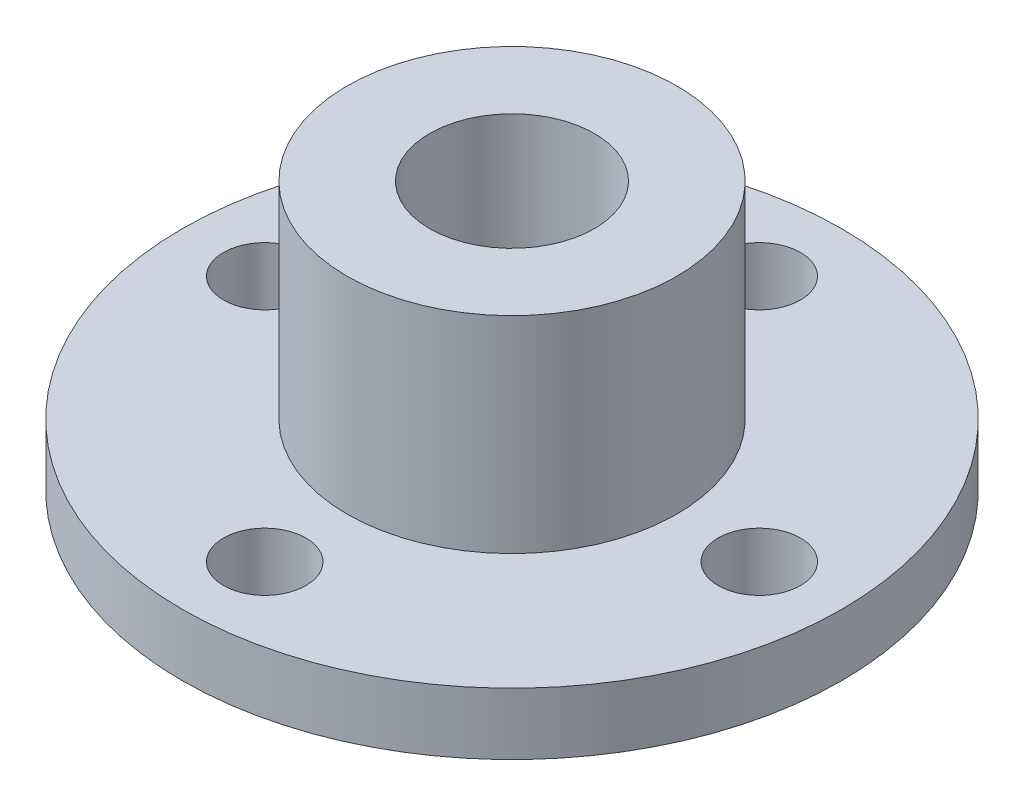
ISO-10303-21;
HEADER;
FILE_DESCRIPTION(('STEP AP214'),'2;1');
FILE_NAME('part.step','',(''),(''),'','','');
FILE_SCHEMA(('AUTOMOTIVE_DESIGN { 1 0 10303 214 1 1 1 1 }'));
ENDSEC;
DATA;
#1=APPLICATION_CONTEXT('core data for automotive mechanical design processes');
#2=APPLICATION_PROTOCOL_DEFINITION('international standard','automotive_design',2000,#1);
#3=PRODUCT_CONTEXT('',#1,'mechanical');
#4=PRODUCT('Part','Part','',(#3));
#5=PRODUCT_RELATED_PRODUCT_CATEGORY('part','',(#4));
#6=PRODUCT_DEFINITION_FORMATION('','',#4);
#7=PRODUCT_DEFINITION_CONTEXT('part definition',#1,'design');
#8=PRODUCT_DEFINITION('design','',#6,#7);
#9=PRODUCT_DEFINITION_SHAPE('','',#8);
#10=(LENGTH_UNIT() NAMED_UNIT(*) SI_UNIT(.MILLI.,.METRE.));
#11=(NAMED_UNIT(*) PLANE_ANGLE_UNIT() SI_UNIT($,.RADIAN.));
#12=(NAMED_UNIT(*) SI_UNIT($,.STERADIAN.) SOLID_ANGLE_UNIT());
#13=UNCERTAINTY_MEASURE_WITH_UNIT(LENGTH_MEASURE(1.E-05),#10,'distance_accuracy_value','');
#14=(GEOMETRIC_REPRESENTATION_CONTEXT(3) GLOBAL_UNCERTAINTY_ASSIGNED_CONTEXT((#13)) GLOBAL_UNIT_ASSIGNED_CONTEXT((#10,
#11,#12)) REPRESENTATION_CONTEXT('',''));
#15=CARTESIAN_POINT('',(0.,0.,0.));
#16=DIRECTION('',(0.,0.,1.));
#17=DIRECTION('',(1.,0.,0.));
#18=AXIS2_PLACEMENT_3D('',#15,#16,#17);
#19=CARTESIAN_POINT('',(0.,3.,0.));
#20=DIRECTION('',(0.,1.,0.));
#21=DIRECTION('',(0.,0.,1.));
#22=AXIS2_PLACEMENT_3D('',#19,#20,#21);
#23=PLANE('',#22);
#24=CARTESIAN_POINT('',(0.,3.,0.));
#25=DIRECTION('',(0.,1.,0.));
#26=DIRECTION('',(0.,0.,1.));
#27=AXIS2_PLACEMENT_3D('',#24,#25,#26);
#28=CIRCLE('',#27,8.);
#29=CARTESIAN_POINT('',(0.,3.,8.));
#30=VERTEX_POINT('',#29);
#31=EDGE_CURVE('E10',#30,#30,#28,.T.);
#32=ORIENTED_EDGE('',*,*,#31,.F.);
#33=EDGE_LOOP('',(#32));
#34=FACE_BOUND('',#33,.T.);
#35=CARTESIAN_POINT('',(0.,3.,12.));
#36=DIRECTION('',(0.,1.,0.));
#37=DIRECTION('',(0.,0.,1.));
#38=AXIS2_PLACEMENT_3D('',#35,#36,#37);
#39=CIRCLE('',#38,2.);
#40=CARTESIAN_POINT('',(0.,3.,14.));
#41=VERTEX_POINT('',#40);
#42=EDGE_CURVE('E57',#41,#41,#39,.T.);
#43=ORIENTED_EDGE('',*,*,#42,.F.);
#44=EDGE_LOOP('',(#43));
#45=FACE_BOUND('',#44,.T.);
#46=CARTESIAN_POINT('',(0.,3.,-12.));
#47=DIRECTION('',(0.,1.,0.));
#48=DIRECTION('',(0.,0.,1.));
#49=AXIS2_PLACEMENT_3D('',#46,#47,#48);
#50=CIRCLE('',#49,2.);
#51=CARTESIAN_POINT('',(0.,3.,-10.));
#52=VERTEX_POINT('',#51);
#53=EDGE_CURVE('E69',#52,#52,#50,.T.);
#54=ORIENTED_EDGE('',*,*,#53,.F.);
#55=EDGE_LOOP('',(#54));
#56=FACE_BOUND('',#55,.T.);
#57=CARTESIAN_POINT('',(0.,3.,0.));
#58=DIRECTION('',(0.,1.,0.));
#59=DIRECTION('',(0.,0.,1.));
#60=AXIS2_PLACEMENT_3D('',#57,#58,#59);
#61=CIRCLE('',#60,16.);
#62=CARTESIAN_POINT('',(0.,3.,16.));
#63=VERTEX_POINT('',#62);
#64=EDGE_CURVE('E41',#63,#63,#61,.T.);
#65=ORIENTED_EDGE('',*,*,#64,.T.);
#66=EDGE_LOOP('',(#65));
#67=FACE_BOUND('',#66,.T.);
#68=CARTESIAN_POINT('',(12.,3.,0.));
#69=DIRECTION('',(0.,1.,0.));
#70=DIRECTION('',(0.,0.,1.));
#71=AXIS2_PLACEMENT_3D('',#68,#69,#70);
#72=CIRCLE('',#71,2.);
#73=CARTESIAN_POINT('',(12.,3.,2.));
#74=VERTEX_POINT('',#73);
#75=EDGE_CURVE('E63',#74,#74,#72,.T.);
#76=ORIENTED_EDGE('',*,*,#75,.F.);
#77=EDGE_LOOP('',(#76));
#78=FACE_BOUND('',#77,.T.);
#79=CARTESIAN_POINT('',(-12.,3.,0.));
#80=DIRECTION('',(0.,1.,0.));
#81=DIRECTION('',(0.,0.,1.));
#82=AXIS2_PLACEMENT_3D('',#79,#80,#81);
#83=CIRCLE('',#82,2.);
#84=CARTESIAN_POINT('',(-12.,3.,2.));
#85=VERTEX_POINT('',#84);
#86=EDGE_CURVE('E50',#85,#85,#83,.T.);
#87=ORIENTED_EDGE('',*,*,#86,.F.);
#88=EDGE_LOOP('',(#87));
#89=FACE_BOUND('',#88,.T.);
#90=ADVANCED_FACE('F33',(#34,#45,#56,#67,#78,#89),#23,.T.);
#91=CARTESIAN_POINT('',(0.,0.,0.));
#92=DIRECTION('',(0.,1.,0.));
#93=DIRECTION('',(0.,0.,1.));
#94=AXIS2_PLACEMENT_3D('',#91,#92,#93);
#95=PLANE('',#94);
#96=CARTESIAN_POINT('',(0.,0.,0.));
#97=DIRECTION('',(0.,1.,0.));
#98=DIRECTION('',(0.,0.,1.));
#99=AXIS2_PLACEMENT_3D('',#96,#97,#98);
#100=CIRCLE('',#99,4.);
#101=CARTESIAN_POINT('',(0.,0.,4.));
#102=VERTEX_POINT('',#101);
#103=EDGE_CURVE('E137',#102,#102,#100,.T.);
#104=ORIENTED_EDGE('',*,*,#103,.T.);
#105=EDGE_LOOP('',(#104));
#106=FACE_BOUND('',#105,.T.);
#107=CARTESIAN_POINT('',(0.,0.,0.));
#108=DIRECTION('',(0.,1.,0.));
#109=DIRECTION('',(0.,0.,1.));
#110=AXIS2_PLACEMENT_3D('',#107,#108,#109);
#111=CIRCLE('',#110,16.);
#112=CARTESIAN_POINT('',(0.,0.,16.));
#113=VERTEX_POINT('',#112);
#114=EDGE_CURVE('E37',#113,#113,#111,.T.);
#115=ORIENTED_EDGE('',*,*,#114,.F.);
#116=EDGE_LOOP('',(#115));
#117=FACE_BOUND('',#116,.T.);
#118=CARTESIAN_POINT('',(0.,0.,-12.));
#119=DIRECTION('',(0.,1.,0.));
#120=DIRECTION('',(0.,0.,1.));
#121=AXIS2_PLACEMENT_3D('',#118,#119,#120);
#122=CIRCLE('',#121,2.);
#123=CARTESIAN_POINT('',(0.,0.,-10.));
#124=VERTEX_POINT('',#123);
#125=EDGE_CURVE('E66',#124,#124,#122,.T.);
#126=ORIENTED_EDGE('',*,*,#125,.T.);
#127=EDGE_LOOP('',(#126));
#128=FACE_BOUND('',#127,.T.);
#129=CARTESIAN_POINT('',(12.,0.,0.));
#130=DIRECTION('',(0.,1.,0.));
#131=DIRECTION('',(0.,0.,1.));
#132=AXIS2_PLACEMENT_3D('',#129,#130,#131);
#133=CIRCLE('',#132,2.);
#134=CARTESIAN_POINT('',(12.,0.,2.));
#135=VERTEX_POINT('',#134);
#136=EDGE_CURVE('E60',#135,#135,#133,.T.);
#137=ORIENTED_EDGE('',*,*,#136,.T.);
#138=EDGE_LOOP('',(#137));
#139=FACE_BOUND('',#138,.T.);
#140=CARTESIAN_POINT('',(0.,0.,12.));
#141=DIRECTION('',(0.,1.,0.));
#142=DIRECTION('',(0.,0.,1.));
#143=AXIS2_PLACEMENT_3D('',#140,#141,#142);
#144=CIRCLE('',#143,2.);
#145=CARTESIAN_POINT('',(0.,0.,14.));
#146=VERTEX_POINT('',#145);
#147=EDGE_CURVE('E53',#146,#146,#144,.T.);
#148=ORIENTED_EDGE('',*,*,#147,.T.);
#149=EDGE_LOOP('',(#148));
#150=FACE_BOUND('',#149,.T.);
#151=CARTESIAN_POINT('',(-12.,0.,0.));
#152=DIRECTION('',(0.,1.,0.));
#153=DIRECTION('',(0.,0.,1.));
#154=AXIS2_PLACEMENT_3D('',#151,#152,#153);
#155=CIRCLE('',#154,2.);
#156=CARTESIAN_POINT('',(-12.,0.,2.));
#157=VERTEX_POINT('',#156);
#158=EDGE_CURVE('E54',#157,#157,#155,.T.);
#159=ORIENTED_EDGE('',*,*,#158,.T.);
#160=EDGE_LOOP('',(#159));
#161=FACE_BOUND('',#160,.T.);
#162=ADVANCED_FACE('F75',(#106,#117,#128,#139,#150,#161),#95,.F.);
#163=CARTESIAN_POINT('',(0.,3.,0.));
#164=DIRECTION('',(0.,-1.,0.));
#165=DIRECTION('',(0.,0.,-1.));
#166=AXIS2_PLACEMENT_3D('',#163,#164,#165);
#167=CYLINDRICAL_SURFACE('',#166,16.);
#168=ORIENTED_EDGE('',*,*,#64,.F.);
#169=EDGE_LOOP('',(#168));
#170=FACE_BOUND('',#169,.T.);
#171=ORIENTED_EDGE('',*,*,#114,.T.);
#172=EDGE_LOOP('',(#171));
#173=FACE_BOUND('',#172,.T.);
#174=ADVANCED_FACE('F35',(#170,#173),#167,.T.);
#175=CARTESIAN_POINT('',(0.,3.,-12.));
#176=DIRECTION('',(0.,-1.,0.));
#177=DIRECTION('',(0.,0.,-1.));
#178=AXIS2_PLACEMENT_3D('',#175,#176,#177);
#179=CYLINDRICAL_SURFACE('',#178,2.);
#180=ORIENTED_EDGE('',*,*,#53,.T.);
#181=EDGE_LOOP('',(#180));
#182=FACE_BOUND('',#181,.T.);
#183=ORIENTED_EDGE('',*,*,#125,.F.);
#184=EDGE_LOOP('',(#183));
#185=FACE_BOUND('',#184,.T.);
#186=ADVANCED_FACE('F78',(#182,#185),#179,.F.);
#187=CARTESIAN_POINT('',(12.,3.,0.));
#188=DIRECTION('',(0.,-1.,0.));
#189=DIRECTION('',(0.,0.,-1.));
#190=AXIS2_PLACEMENT_3D('',#187,#188,#189);
#191=CYLINDRICAL_SURFACE('',#190,2.);
#192=ORIENTED_EDGE('',*,*,#75,.T.);
#193=EDGE_LOOP('',(#192));
#194=FACE_BOUND('',#193,.T.);
#195=ORIENTED_EDGE('',*,*,#136,.F.);
#196=EDGE_LOOP('',(#195));
#197=FACE_BOUND('',#196,.T.);
#198=ADVANCED_FACE('F80',(#194,#197),#191,.F.);
#199=CARTESIAN_POINT('',(0.,3.,12.));
#200=DIRECTION('',(0.,-1.,0.));
#201=DIRECTION('',(0.,0.,-1.));
#202=AXIS2_PLACEMENT_3D('',#199,#200,#201);
#203=CYLINDRICAL_SURFACE('',#202,2.);
#204=ORIENTED_EDGE('',*,*,#42,.T.);
#205=EDGE_LOOP('',(#204));
#206=FACE_BOUND('',#205,.T.);
#207=ORIENTED_EDGE('',*,*,#147,.F.);
#208=EDGE_LOOP('',(#207));
#209=FACE_BOUND('',#208,.T.);
#210=ADVANCED_FACE('F87',(#206,#209),#203,.F.);
#211=CARTESIAN_POINT('',(-12.,3.,0.));
#212=DIRECTION('',(0.,-1.,0.));
#213=DIRECTION('',(0.,0.,-1.));
#214=AXIS2_PLACEMENT_3D('',#211,#212,#213);
#215=CYLINDRICAL_SURFACE('',#214,2.);
#216=ORIENTED_EDGE('',*,*,#86,.T.);
#217=EDGE_LOOP('',(#216));
#218=FACE_BOUND('',#217,.T.);
#219=ORIENTED_EDGE('',*,*,#158,.F.);
#220=EDGE_LOOP('',(#219));
#221=FACE_BOUND('',#220,.T.);
#222=ADVANCED_FACE('F109',(#218,#221),#215,.F.);
#223=CARTESIAN_POINT('',(0.,13.,0.));
#224=DIRECTION('',(0.,-1.,0.));
#225=DIRECTION('',(0.,0.,-1.));
#226=AXIS2_PLACEMENT_3D('',#223,#224,#225);
#227=CYLINDRICAL_SURFACE('',#226,8.);
#228=CARTESIAN_POINT('',(0.,13.,0.));
#229=DIRECTION('',(0.,1.,0.));
#230=DIRECTION('',(0.,0.,1.));
#231=AXIS2_PLACEMENT_3D('',#228,#229,#230);
#232=CIRCLE('',#231,8.);
#233=CARTESIAN_POINT('',(0.,13.,8.));
#234=VERTEX_POINT('',#233);
#235=EDGE_CURVE('E48',#234,#234,#232,.T.);
#236=ORIENTED_EDGE('',*,*,#235,.F.);
#237=EDGE_LOOP('',(#236));
#238=FACE_BOUND('',#237,.T.);
#239=ORIENTED_EDGE('',*,*,#31,.T.);
#240=EDGE_LOOP('',(#239));
#241=FACE_BOUND('',#240,.T.);
#242=ADVANCED_FACE('F112',(#238,#241),#227,.T.);
#243=CARTESIAN_POINT('',(0.,13.,0.));
#244=DIRECTION('',(0.,1.,0.));
#245=DIRECTION('',(0.,0.,1.));
#246=AXIS2_PLACEMENT_3D('',#243,#244,#245);
#247=PLANE('',#246);
#248=CARTESIAN_POINT('',(0.,13.,0.));
#249=DIRECTION('',(0.,1.,0.));
#250=DIRECTION('',(0.,0.,1.));
#251=AXIS2_PLACEMENT_3D('',#248,#249,#250);
#252=CIRCLE('',#251,4.);
#253=CARTESIAN_POINT('',(0.,13.,4.));
#254=VERTEX_POINT('',#253);
#255=EDGE_CURVE('E140',#254,#254,#252,.T.);
#256=ORIENTED_EDGE('',*,*,#255,.F.);
#257=EDGE_LOOP('',(#256));
#258=FACE_BOUND('',#257,.T.);
#259=ORIENTED_EDGE('',*,*,#235,.T.);
#260=EDGE_LOOP('',(#259));
#261=FACE_BOUND('',#260,.T.);
#262=ADVANCED_FACE('F120',(#258,#261),#247,.T.);
#263=CARTESIAN_POINT('',(0.,0.,0.));
#264=DIRECTION('',(0.,1.,0.));
#265=DIRECTION('',(0.,0.,1.));
#266=AXIS2_PLACEMENT_3D('',#263,#264,#265);
#267=CYLINDRICAL_SURFACE('',#266,4.);
#268=ORIENTED_EDGE('',*,*,#103,.F.);
#269=EDGE_LOOP('',(#268));
#270=FACE_BOUND('',#269,.T.);
#271=ORIENTED_EDGE('',*,*,#255,.T.);
#272=EDGE_LOOP('',(#271));
#273=FACE_BOUND('',#272,.T.);
#274=ADVANCED_FACE('F128',(#270,#273),#267,.F.);
#275=CLOSED_SHELL('',(#90,#162,#174,#186,#198,#210,#222,#242,#262,#274));
#276=MANIFOLD_SOLID_BREP('B2',#275);
#277=ADVANCED_BREP_SHAPE_REPRESENTATION('',(#18,#276),#14);
#278=SHAPE_DEFINITION_REPRESENTATION(#9,#277);
ENDSEC;
END-ISO-10303-21;
